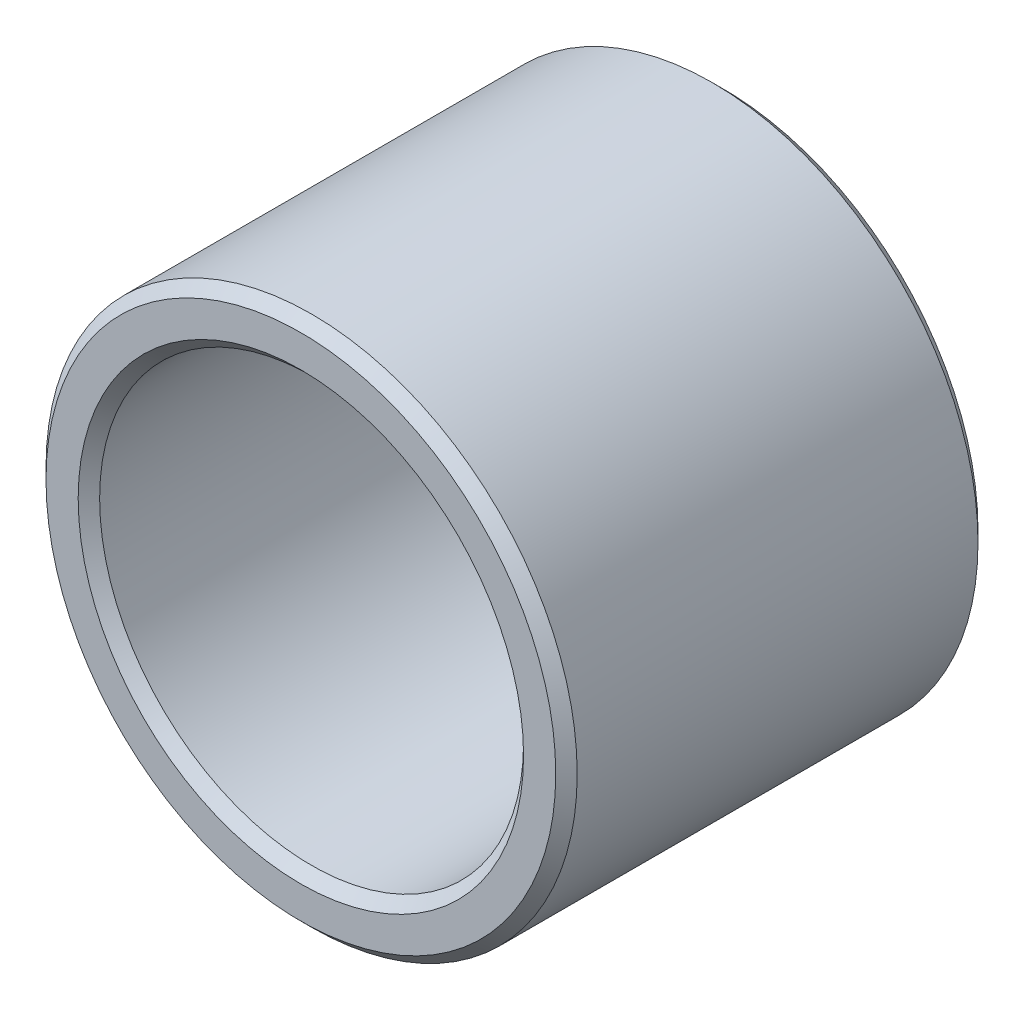
ISO-10303-21;
HEADER;
FILE_DESCRIPTION(('STEP AP214'),'2;1');
FILE_NAME('part.step','',(''),(''),'','','');
FILE_SCHEMA(('AUTOMOTIVE_DESIGN { 1 0 10303 214 1 1 1 1 }'));
ENDSEC;
DATA;
#1=APPLICATION_CONTEXT('core data for automotive mechanical design processes');
#2=APPLICATION_PROTOCOL_DEFINITION('international standard','automotive_design',2000,#1);
#3=PRODUCT_CONTEXT('',#1,'mechanical');
#4=PRODUCT('Part','Part','',(#3));
#5=PRODUCT_RELATED_PRODUCT_CATEGORY('part','',(#4));
#6=PRODUCT_DEFINITION_FORMATION('','',#4);
#7=PRODUCT_DEFINITION_CONTEXT('part definition',#1,'design');
#8=PRODUCT_DEFINITION('design','',#6,#7);
#9=PRODUCT_DEFINITION_SHAPE('','',#8);
#10=(LENGTH_UNIT() NAMED_UNIT(*) SI_UNIT(.MILLI.,.METRE.));
#11=(NAMED_UNIT(*) PLANE_ANGLE_UNIT() SI_UNIT($,.RADIAN.));
#12=(NAMED_UNIT(*) SI_UNIT($,.STERADIAN.) SOLID_ANGLE_UNIT());
#13=UNCERTAINTY_MEASURE_WITH_UNIT(LENGTH_MEASURE(1.E-05),#10,'distance_accuracy_value','');
#14=(GEOMETRIC_REPRESENTATION_CONTEXT(3) GLOBAL_UNCERTAINTY_ASSIGNED_CONTEXT((#13)) GLOBAL_UNIT_ASSIGNED_CONTEXT((#10,
#11,#12)) REPRESENTATION_CONTEXT('',''));
#15=CARTESIAN_POINT('',(0.,0.,0.));
#16=DIRECTION('',(0.,0.,1.));
#17=DIRECTION('',(1.,0.,0.));
#18=AXIS2_PLACEMENT_3D('',#15,#16,#17);
#19=CARTESIAN_POINT('',(0.,0.,-3.175));
#20=DIRECTION('',(0.,0.,1.));
#21=DIRECTION('',(1.,0.,0.));
#22=AXIS2_PLACEMENT_3D('',#19,#20,#21);
#23=CYLINDRICAL_SURFACE('',#22,3.99415);
#24=CARTESIAN_POINT('',(0.,0.,-3.01371));
#25=DIRECTION('',(0.,0.,1.));
#26=DIRECTION('',(1.,0.,0.));
#27=AXIS2_PLACEMENT_3D('',#24,#25,#26);
#28=CIRCLE('',#27,3.99415);
#29=CARTESIAN_POINT('',(3.99415,0.,-3.01371));
#30=VERTEX_POINT('',#29);
#31=EDGE_CURVE('E78',#30,#30,#28,.T.);
#32=ORIENTED_EDGE('',*,*,#31,.T.);
#33=EDGE_LOOP('',(#32));
#34=FACE_BOUND('',#33,.T.);
#35=CARTESIAN_POINT('',(0.,0.,3.01371));
#36=DIRECTION('',(0.,0.,1.));
#37=DIRECTION('',(1.,0.,0.));
#38=AXIS2_PLACEMENT_3D('',#35,#36,#37);
#39=CIRCLE('',#38,3.99415);
#40=CARTESIAN_POINT('',(3.99415,0.,3.01371));
#41=VERTEX_POINT('',#40);
#42=EDGE_CURVE('E82',#41,#41,#39,.F.);
#43=ORIENTED_EDGE('',*,*,#42,.T.);
#44=EDGE_LOOP('',(#43));
#45=FACE_BOUND('',#44,.T.);
#46=ADVANCED_FACE('F43',(#34,#45),#23,.T.);
#47=CARTESIAN_POINT('',(0.,0.,-3.175));
#48=DIRECTION('',(0.,0.,1.));
#49=DIRECTION('',(1.,0.,0.));
#50=AXIS2_PLACEMENT_3D('',#47,#48,#49);
#51=PLANE('',#50);
#52=CARTESIAN_POINT('',(0.,0.,-3.175));
#53=DIRECTION('',(0.,0.,1.));
#54=DIRECTION('',(1.,0.,0.));
#55=AXIS2_PLACEMENT_3D('',#52,#53,#54);
#56=CIRCLE('',#55,3.83286);
#57=CARTESIAN_POINT('',(3.83286,0.,-3.175));
#58=VERTEX_POINT('',#57);
#59=EDGE_CURVE('E70',#58,#58,#56,.F.);
#60=ORIENTED_EDGE('',*,*,#59,.T.);
#61=EDGE_LOOP('',(#60));
#62=FACE_BOUND('',#61,.T.);
#63=CARTESIAN_POINT('',(0.,0.,-3.175));
#64=DIRECTION('',(0.,0.,1.));
#65=DIRECTION('',(1.,0.,0.));
#66=AXIS2_PLACEMENT_3D('',#63,#64,#65);
#67=CIRCLE('',#66,3.34899);
#68=CARTESIAN_POINT('',(3.34899,0.,-3.175));
#69=VERTEX_POINT('',#68);
#70=EDGE_CURVE('E74',#69,#69,#67,.T.);
#71=ORIENTED_EDGE('',*,*,#70,.T.);
#72=EDGE_LOOP('',(#71));
#73=FACE_BOUND('',#72,.T.);
#74=ADVANCED_FACE('F98',(#62,#73),#51,.F.);
#75=CARTESIAN_POINT('',(0.,0.,-3.175));
#76=DIRECTION('',(0.,0.,1.));
#77=DIRECTION('',(1.,0.,0.));
#78=AXIS2_PLACEMENT_3D('',#75,#76,#77);
#79=CYLINDRICAL_SURFACE('',#78,3.1877);
#80=CARTESIAN_POINT('',(0.,0.,-3.01371));
#81=DIRECTION('',(0.,0.,1.));
#82=DIRECTION('',(1.,0.,0.));
#83=AXIS2_PLACEMENT_3D('',#80,#81,#82);
#84=CIRCLE('',#83,3.1877);
#85=CARTESIAN_POINT('',(3.1877,0.,-3.01371));
#86=VERTEX_POINT('',#85);
#87=EDGE_CURVE('E58',#86,#86,#84,.F.);
#88=ORIENTED_EDGE('',*,*,#87,.T.);
#89=EDGE_LOOP('',(#88));
#90=FACE_BOUND('',#89,.T.);
#91=CARTESIAN_POINT('',(0.,0.,3.01371));
#92=DIRECTION('',(0.,0.,1.));
#93=DIRECTION('',(1.,0.,0.));
#94=AXIS2_PLACEMENT_3D('',#91,#92,#93);
#95=CIRCLE('',#94,3.1877);
#96=CARTESIAN_POINT('',(3.1877,0.,3.01371));
#97=VERTEX_POINT('',#96);
#98=EDGE_CURVE('E64',#97,#97,#95,.T.);
#99=ORIENTED_EDGE('',*,*,#98,.T.);
#100=EDGE_LOOP('',(#99));
#101=FACE_BOUND('',#100,.T.);
#102=ADVANCED_FACE('F104',(#90,#101),#79,.F.);
#103=CARTESIAN_POINT('',(0.,0.,3.175));
#104=DIRECTION('',(0.,0.,1.));
#105=DIRECTION('',(1.,0.,0.));
#106=AXIS2_PLACEMENT_3D('',#103,#104,#105);
#107=PLANE('',#106);
#108=CARTESIAN_POINT('',(0.,0.,3.175));
#109=DIRECTION('',(0.,0.,1.));
#110=DIRECTION('',(1.,0.,0.));
#111=AXIS2_PLACEMENT_3D('',#108,#109,#110);
#112=CIRCLE('',#111,3.34899);
#113=CARTESIAN_POINT('',(3.34899,0.,3.175));
#114=VERTEX_POINT('',#113);
#115=EDGE_CURVE('E10',#114,#114,#112,.F.);
#116=ORIENTED_EDGE('',*,*,#115,.T.);
#117=EDGE_LOOP('',(#116));
#118=FACE_BOUND('',#117,.T.);
#119=CARTESIAN_POINT('',(0.,0.,3.175));
#120=DIRECTION('',(0.,0.,1.));
#121=DIRECTION('',(1.,0.,0.));
#122=AXIS2_PLACEMENT_3D('',#119,#120,#121);
#123=CIRCLE('',#122,3.83286);
#124=CARTESIAN_POINT('',(3.83286,0.,3.175));
#125=VERTEX_POINT('',#124);
#126=EDGE_CURVE('E52',#125,#125,#123,.T.);
#127=ORIENTED_EDGE('',*,*,#126,.T.);
#128=EDGE_LOOP('',(#127));
#129=FACE_BOUND('',#128,.T.);
#130=ADVANCED_FACE('F116',(#118,#129),#107,.T.);
#131=CARTESIAN_POINT('',(0.,0.,-3.01371));
#132=DIRECTION('',(0.,0.,1.));
#133=DIRECTION('',(1.,0.,0.));
#134=AXIS2_PLACEMENT_3D('',#131,#132,#133);
#135=CONICAL_SURFACE('',#134,3.99415,0.785398163397448);
#136=ORIENTED_EDGE('',*,*,#59,.F.);
#137=EDGE_LOOP('',(#136));
#138=FACE_BOUND('',#137,.T.);
#139=ORIENTED_EDGE('',*,*,#31,.F.);
#140=EDGE_LOOP('',(#139));
#141=FACE_BOUND('',#140,.T.);
#142=ADVANCED_FACE('F110',(#138,#141),#135,.T.);
#143=CARTESIAN_POINT('',(0.,0.,-3.175));
#144=DIRECTION('',(0.,0.,-1.));
#145=DIRECTION('',(-1.,0.,0.));
#146=AXIS2_PLACEMENT_3D('',#143,#144,#145);
#147=CONICAL_SURFACE('',#146,3.34899,0.785398163397448);
#148=ORIENTED_EDGE('',*,*,#87,.F.);
#149=EDGE_LOOP('',(#148));
#150=FACE_BOUND('',#149,.T.);
#151=ORIENTED_EDGE('',*,*,#70,.F.);
#152=EDGE_LOOP('',(#151));
#153=FACE_BOUND('',#152,.T.);
#154=ADVANCED_FACE('F95',(#150,#153),#147,.F.);
#155=CARTESIAN_POINT('',(0.,0.,3.01371));
#156=DIRECTION('',(0.,0.,1.));
#157=DIRECTION('',(1.,0.,0.));
#158=AXIS2_PLACEMENT_3D('',#155,#156,#157);
#159=CONICAL_SURFACE('',#158,3.1877,0.785398163397447);
#160=ORIENTED_EDGE('',*,*,#115,.F.);
#161=EDGE_LOOP('',(#160));
#162=FACE_BOUND('',#161,.T.);
#163=ORIENTED_EDGE('',*,*,#98,.F.);
#164=EDGE_LOOP('',(#163));
#165=FACE_BOUND('',#164,.T.);
#166=ADVANCED_FACE('F91',(#162,#165),#159,.F.);
#167=CARTESIAN_POINT('',(0.,0.,3.175));
#168=DIRECTION('',(0.,0.,-1.));
#169=DIRECTION('',(-1.,0.,0.));
#170=AXIS2_PLACEMENT_3D('',#167,#168,#169);
#171=CONICAL_SURFACE('',#170,3.83286,0.785398163397446);
#172=ORIENTED_EDGE('',*,*,#42,.F.);
#173=EDGE_LOOP('',(#172));
#174=FACE_BOUND('',#173,.T.);
#175=ORIENTED_EDGE('',*,*,#126,.F.);
#176=EDGE_LOOP('',(#175));
#177=FACE_BOUND('',#176,.T.);
#178=ADVANCED_FACE('F46',(#174,#177),#171,.T.);
#179=CLOSED_SHELL('',(#46,#74,#102,#130,#142,#154,#166,#178));
#180=MANIFOLD_SOLID_BREP('B2',#179);
#181=ADVANCED_BREP_SHAPE_REPRESENTATION('',(#18,#180),#14);
#182=SHAPE_DEFINITION_REPRESENTATION(#9,#181);
ENDSEC;
END-ISO-10303-21;
